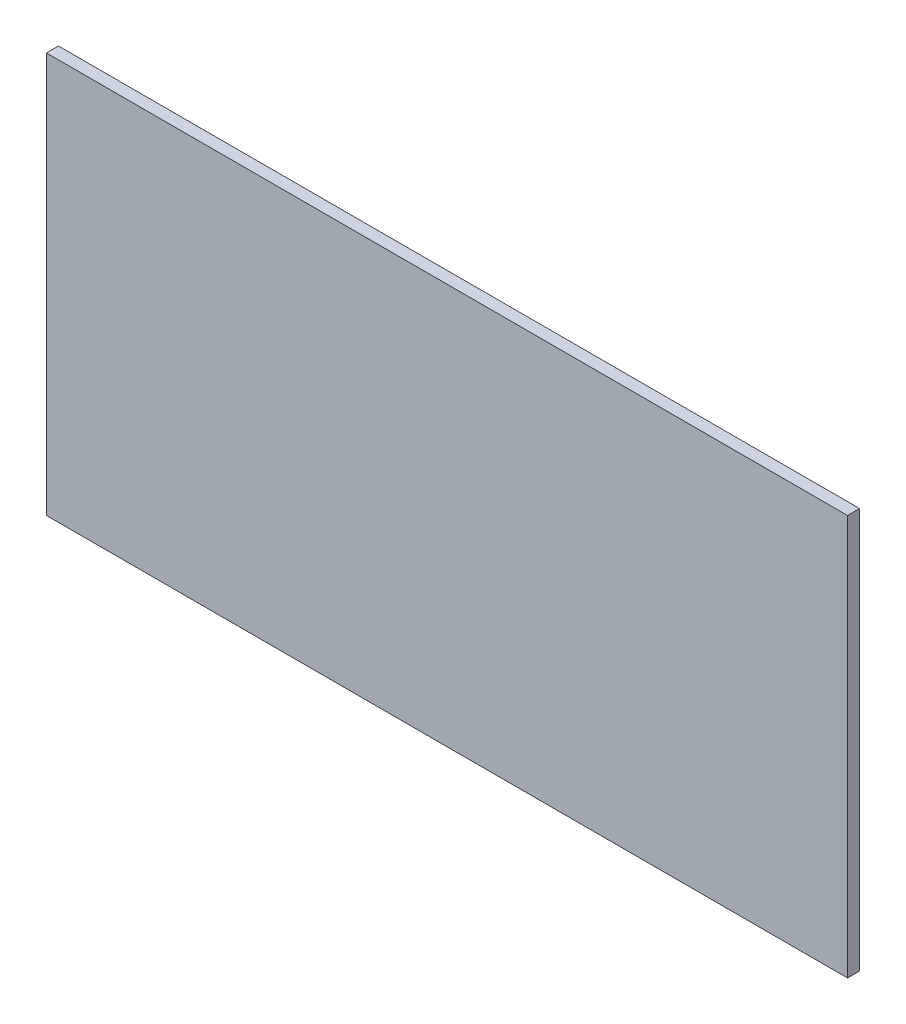
ISO-10303-21;
HEADER;
FILE_DESCRIPTION(('STEP AP214'),'2;1');
FILE_NAME('part.step','',(''),(''),'','','');
FILE_SCHEMA(('AUTOMOTIVE_DESIGN { 1 0 10303 214 1 1 1 1 }'));
ENDSEC;
DATA;
#1=APPLICATION_CONTEXT('core data for automotive mechanical design processes');
#2=APPLICATION_PROTOCOL_DEFINITION('international standard','automotive_design',2000,#1);
#3=PRODUCT_CONTEXT('',#1,'mechanical');
#4=PRODUCT('Part','Part','',(#3));
#5=PRODUCT_RELATED_PRODUCT_CATEGORY('part','',(#4));
#6=PRODUCT_DEFINITION_FORMATION('','',#4);
#7=PRODUCT_DEFINITION_CONTEXT('part definition',#1,'design');
#8=PRODUCT_DEFINITION('design','',#6,#7);
#9=PRODUCT_DEFINITION_SHAPE('','',#8);
#10=(LENGTH_UNIT() NAMED_UNIT(*) SI_UNIT(.MILLI.,.METRE.));
#11=(NAMED_UNIT(*) PLANE_ANGLE_UNIT() SI_UNIT($,.RADIAN.));
#12=(NAMED_UNIT(*) SI_UNIT($,.STERADIAN.) SOLID_ANGLE_UNIT());
#13=UNCERTAINTY_MEASURE_WITH_UNIT(LENGTH_MEASURE(1.E-05),#10,'distance_accuracy_value','');
#14=(GEOMETRIC_REPRESENTATION_CONTEXT(3) GLOBAL_UNCERTAINTY_ASSIGNED_CONTEXT((#13)) GLOBAL_UNIT_ASSIGNED_CONTEXT((#10,
#11,#12)) REPRESENTATION_CONTEXT('',''));
#15=CARTESIAN_POINT('',(0.,0.,0.));
#16=DIRECTION('',(0.,0.,1.));
#17=DIRECTION('',(1.,0.,0.));
#18=AXIS2_PLACEMENT_3D('',#15,#16,#17);
#19=CARTESIAN_POINT('',(0.,0.,1.5));
#20=DIRECTION('',(-1.,0.,0.));
#21=DIRECTION('',(0.,-1.,0.));
#22=AXIS2_PLACEMENT_3D('',#19,#20,#21);
#23=PLANE('',#22);
#24=DIRECTION('',(0.,1.,0.));
#25=VECTOR('',#24,1.);
#26=CARTESIAN_POINT('',(0.,0.,0.));
#27=LINE('',#26,#25);
#28=CARTESIAN_POINT('',(0.,-50.,0.));
#29=VERTEX_POINT('',#28);
#30=CARTESIAN_POINT('',(0.,0.,0.));
#31=VERTEX_POINT('',#30);
#32=EDGE_CURVE('E96',#29,#31,#27,.T.);
#33=ORIENTED_EDGE('',*,*,#32,.T.);
#34=DIRECTION('',(0.,0.,-1.));
#35=VECTOR('',#34,1.);
#36=CARTESIAN_POINT('',(0.,0.,1.5));
#37=LINE('',#36,#35);
#38=CARTESIAN_POINT('',(0.,0.,1.5));
#39=VERTEX_POINT('',#38);
#40=EDGE_CURVE('E11',#39,#31,#37,.T.);
#41=ORIENTED_EDGE('',*,*,#40,.F.);
#42=DIRECTION('',(0.,1.,0.));
#43=VECTOR('',#42,1.);
#44=CARTESIAN_POINT('',(0.,0.,1.5));
#45=LINE('',#44,#43);
#46=CARTESIAN_POINT('',(0.,-50.,1.5));
#47=VERTEX_POINT('',#46);
#48=EDGE_CURVE('E84',#47,#39,#45,.T.);
#49=ORIENTED_EDGE('',*,*,#48,.F.);
#50=DIRECTION('',(0.,0.,-1.));
#51=VECTOR('',#50,1.);
#52=CARTESIAN_POINT('',(0.,-50.,1.5));
#53=LINE('',#52,#51);
#54=EDGE_CURVE('E92',#47,#29,#53,.T.);
#55=ORIENTED_EDGE('',*,*,#54,.T.);
#56=EDGE_LOOP('',(#33,#41,#49,#55));
#57=FACE_BOUND('',#56,.T.);
#58=ADVANCED_FACE('F33',(#57),#23,.F.);
#59=CARTESIAN_POINT('',(0.,0.,1.5));
#60=DIRECTION('',(0.,-1.,0.));
#61=DIRECTION('',(0.,0.,-1.));
#62=AXIS2_PLACEMENT_3D('',#59,#60,#61);
#63=PLANE('',#62);
#64=DIRECTION('',(-1.,0.,0.));
#65=VECTOR('',#64,1.);
#66=CARTESIAN_POINT('',(0.,0.,0.));
#67=LINE('',#66,#65);
#68=CARTESIAN_POINT('',(-100.,0.,0.));
#69=VERTEX_POINT('',#68);
#70=EDGE_CURVE('E88',#31,#69,#67,.T.);
#71=ORIENTED_EDGE('',*,*,#70,.T.);
#72=DIRECTION('',(0.,0.,-1.));
#73=VECTOR('',#72,1.);
#74=CARTESIAN_POINT('',(-100.,0.,1.5));
#75=LINE('',#74,#73);
#76=CARTESIAN_POINT('',(-100.,0.,1.5));
#77=VERTEX_POINT('',#76);
#78=EDGE_CURVE('E41',#77,#69,#75,.T.);
#79=ORIENTED_EDGE('',*,*,#78,.F.);
#80=DIRECTION('',(-1.,0.,0.));
#81=VECTOR('',#80,1.);
#82=CARTESIAN_POINT('',(0.,0.,1.5));
#83=LINE('',#82,#81);
#84=EDGE_CURVE('E79',#39,#77,#83,.T.);
#85=ORIENTED_EDGE('',*,*,#84,.F.);
#86=ORIENTED_EDGE('',*,*,#40,.T.);
#87=EDGE_LOOP('',(#71,#79,#85,#86));
#88=FACE_BOUND('',#87,.T.);
#89=ADVANCED_FACE('F87',(#88),#63,.F.);
#90=CARTESIAN_POINT('',(-100.,0.,1.5));
#91=DIRECTION('',(1.,0.,0.));
#92=DIRECTION('',(0.,0.,-1.));
#93=AXIS2_PLACEMENT_3D('',#90,#91,#92);
#94=PLANE('',#93);
#95=DIRECTION('',(0.,-1.,0.));
#96=VECTOR('',#95,1.);
#97=CARTESIAN_POINT('',(-100.,0.,0.));
#98=LINE('',#97,#96);
#99=CARTESIAN_POINT('',(-100.,-50.,0.));
#100=VERTEX_POINT('',#99);
#101=EDGE_CURVE('E66',#69,#100,#98,.T.);
#102=ORIENTED_EDGE('',*,*,#101,.T.);
#103=DIRECTION('',(0.,0.,-1.));
#104=VECTOR('',#103,1.);
#105=CARTESIAN_POINT('',(-100.,-50.,1.5));
#106=LINE('',#105,#104);
#107=CARTESIAN_POINT('',(-100.,-50.,1.5));
#108=VERTEX_POINT('',#107);
#109=EDGE_CURVE('E89',#108,#100,#106,.T.);
#110=ORIENTED_EDGE('',*,*,#109,.F.);
#111=DIRECTION('',(0.,-1.,0.));
#112=VECTOR('',#111,1.);
#113=CARTESIAN_POINT('',(-100.,0.,1.5));
#114=LINE('',#113,#112);
#115=EDGE_CURVE('E82',#77,#108,#114,.T.);
#116=ORIENTED_EDGE('',*,*,#115,.F.);
#117=ORIENTED_EDGE('',*,*,#78,.T.);
#118=EDGE_LOOP('',(#102,#110,#116,#117));
#119=FACE_BOUND('',#118,.T.);
#120=ADVANCED_FACE('F90',(#119),#94,.F.);
#121=CARTESIAN_POINT('',(0.,-50.,1.5));
#122=DIRECTION('',(0.,1.,0.));
#123=DIRECTION('',(-1.,0.,0.));
#124=AXIS2_PLACEMENT_3D('',#121,#122,#123);
#125=PLANE('',#124);
#126=DIRECTION('',(1.,0.,0.));
#127=VECTOR('',#126,1.);
#128=CARTESIAN_POINT('',(0.,-50.,0.));
#129=LINE('',#128,#127);
#130=EDGE_CURVE('E72',#100,#29,#129,.T.);
#131=ORIENTED_EDGE('',*,*,#130,.T.);
#132=ORIENTED_EDGE('',*,*,#54,.F.);
#133=DIRECTION('',(1.,0.,0.));
#134=VECTOR('',#133,1.);
#135=CARTESIAN_POINT('',(0.,-50.,1.5));
#136=LINE('',#135,#134);
#137=EDGE_CURVE('E49',#108,#47,#136,.T.);
#138=ORIENTED_EDGE('',*,*,#137,.F.);
#139=ORIENTED_EDGE('',*,*,#109,.T.);
#140=EDGE_LOOP('',(#131,#132,#138,#139));
#141=FACE_BOUND('',#140,.T.);
#142=ADVANCED_FACE('F103',(#141),#125,.F.);
#143=CARTESIAN_POINT('',(0.,0.,1.5));
#144=DIRECTION('',(0.,0.,-1.));
#145=DIRECTION('',(-1.,0.,0.));
#146=AXIS2_PLACEMENT_3D('',#143,#144,#145);
#147=PLANE('',#146);
#148=ORIENTED_EDGE('',*,*,#48,.T.);
#149=ORIENTED_EDGE('',*,*,#84,.T.);
#150=ORIENTED_EDGE('',*,*,#115,.T.);
#151=ORIENTED_EDGE('',*,*,#137,.T.);
#152=EDGE_LOOP('',(#148,#149,#150,#151));
#153=FACE_BOUND('',#152,.T.);
#154=ADVANCED_FACE('F80',(#153),#147,.F.);
#155=CARTESIAN_POINT('',(0.,0.,0.));
#156=DIRECTION('',(0.,0.,-1.));
#157=DIRECTION('',(-1.,0.,0.));
#158=AXIS2_PLACEMENT_3D('',#155,#156,#157);
#159=PLANE('',#158);
#160=ORIENTED_EDGE('',*,*,#32,.F.);
#161=ORIENTED_EDGE('',*,*,#130,.F.);
#162=ORIENTED_EDGE('',*,*,#101,.F.);
#163=ORIENTED_EDGE('',*,*,#70,.F.);
#164=EDGE_LOOP('',(#160,#161,#162,#163));
#165=FACE_BOUND('',#164,.T.);
#166=ADVANCED_FACE('F106',(#165),#159,.T.);
#167=CLOSED_SHELL('',(#58,#89,#120,#142,#154,#166));
#168=MANIFOLD_SOLID_BREP('B2',#167);
#169=ADVANCED_BREP_SHAPE_REPRESENTATION('',(#18,#168),#14);
#170=SHAPE_DEFINITION_REPRESENTATION(#9,#169);
ENDSEC;
END-ISO-10303-21;
